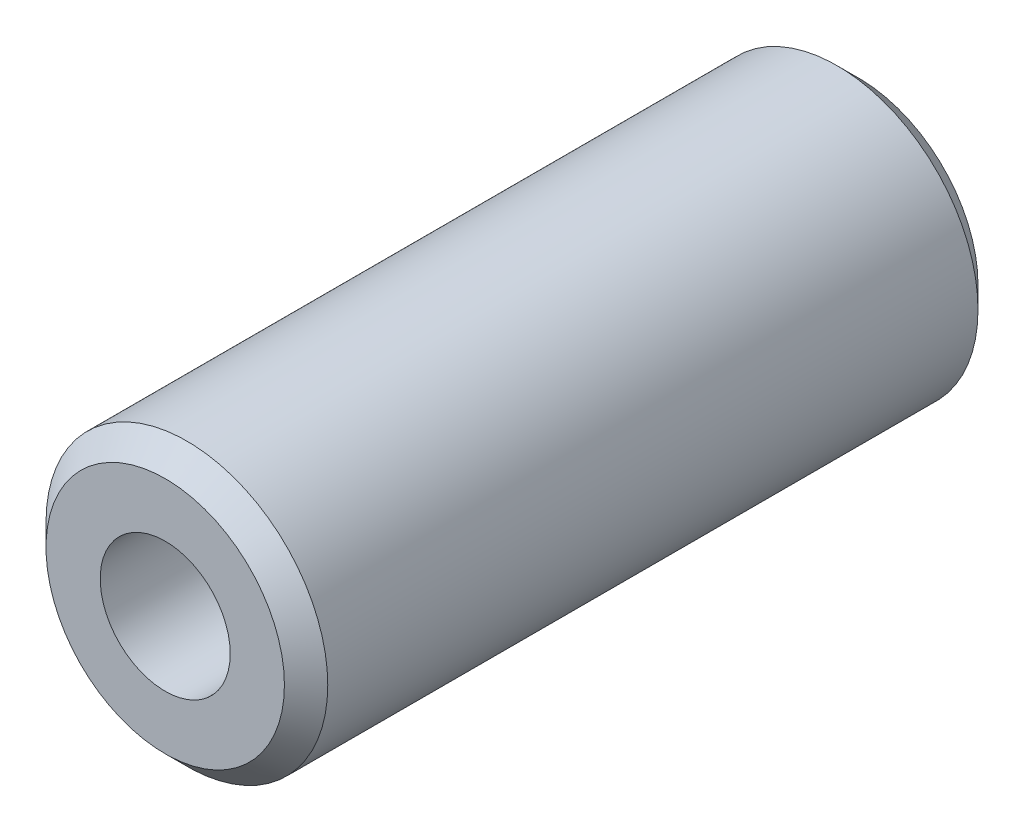
ISO-10303-21;
HEADER;
FILE_DESCRIPTION(('STEP AP214'),'2;1');
FILE_NAME('part.step','',(''),(''),'','','');
FILE_SCHEMA(('AUTOMOTIVE_DESIGN { 1 0 10303 214 1 1 1 1 }'));
ENDSEC;
DATA;
#1=APPLICATION_CONTEXT('core data for automotive mechanical design processes');
#2=APPLICATION_PROTOCOL_DEFINITION('international standard','automotive_design',2000,#1);
#3=PRODUCT_CONTEXT('',#1,'mechanical');
#4=PRODUCT('Part','Part','',(#3));
#5=PRODUCT_RELATED_PRODUCT_CATEGORY('part','',(#4));
#6=PRODUCT_DEFINITION_FORMATION('','',#4);
#7=PRODUCT_DEFINITION_CONTEXT('part definition',#1,'design');
#8=PRODUCT_DEFINITION('design','',#6,#7);
#9=PRODUCT_DEFINITION_SHAPE('','',#8);
#10=(LENGTH_UNIT() NAMED_UNIT(*) SI_UNIT(.MILLI.,.METRE.));
#11=(NAMED_UNIT(*) PLANE_ANGLE_UNIT() SI_UNIT($,.RADIAN.));
#12=(NAMED_UNIT(*) SI_UNIT($,.STERADIAN.) SOLID_ANGLE_UNIT());
#13=UNCERTAINTY_MEASURE_WITH_UNIT(LENGTH_MEASURE(1.E-05),#10,'distance_accuracy_value','');
#14=(GEOMETRIC_REPRESENTATION_CONTEXT(3) GLOBAL_UNCERTAINTY_ASSIGNED_CONTEXT((#13)) GLOBAL_UNIT_ASSIGNED_CONTEXT((#10,
#11,#12)) REPRESENTATION_CONTEXT('',''));
#15=CARTESIAN_POINT('',(0.,0.,0.));
#16=DIRECTION('',(0.,0.,1.));
#17=DIRECTION('',(1.,0.,0.));
#18=AXIS2_PLACEMENT_3D('',#15,#16,#17);
#19=CARTESIAN_POINT('',(0.,0.,32.));
#20=DIRECTION('',(0.,0.,1.));
#21=DIRECTION('',(1.,0.,0.));
#22=AXIS2_PLACEMENT_3D('',#19,#20,#21);
#23=PLANE('',#22);
#24=CARTESIAN_POINT('',(0.,0.,32.));
#25=DIRECTION('',(0.,0.,1.));
#26=DIRECTION('',(1.,0.,0.));
#27=AXIS2_PLACEMENT_3D('',#24,#25,#26);
#28=CIRCLE('',#27,5.5);
#29=CARTESIAN_POINT('',(5.5,0.,32.));
#30=VERTEX_POINT('',#29);
#31=EDGE_CURVE('E10',#30,#30,#28,.T.);
#32=ORIENTED_EDGE('',*,*,#31,.T.);
#33=EDGE_LOOP('',(#32));
#34=FACE_BOUND('',#33,.T.);
#35=CARTESIAN_POINT('',(0.,0.,32.));
#36=DIRECTION('',(0.,0.,1.));
#37=DIRECTION('',(1.,0.,0.));
#38=AXIS2_PLACEMENT_3D('',#35,#36,#37);
#39=CIRCLE('',#38,3.);
#40=CARTESIAN_POINT('',(3.,0.,32.));
#41=VERTEX_POINT('',#40);
#42=EDGE_CURVE('E65',#41,#41,#39,.T.);
#43=ORIENTED_EDGE('',*,*,#42,.F.);
#44=EDGE_LOOP('',(#43));
#45=FACE_BOUND('',#44,.T.);
#46=ADVANCED_FACE('F41',(#34,#45),#23,.T.);
#47=CARTESIAN_POINT('',(0.,0.,0.));
#48=DIRECTION('',(0.,0.,1.));
#49=DIRECTION('',(1.,0.,0.));
#50=AXIS2_PLACEMENT_3D('',#47,#48,#49);
#51=PLANE('',#50);
#52=CARTESIAN_POINT('',(0.,0.,0.));
#53=DIRECTION('',(0.,0.,1.));
#54=DIRECTION('',(1.,0.,0.));
#55=AXIS2_PLACEMENT_3D('',#52,#53,#54);
#56=CIRCLE('',#55,5.5);
#57=CARTESIAN_POINT('',(5.5,0.,0.));
#58=VERTEX_POINT('',#57);
#59=EDGE_CURVE('E47',#58,#58,#56,.F.);
#60=ORIENTED_EDGE('',*,*,#59,.T.);
#61=EDGE_LOOP('',(#60));
#62=FACE_BOUND('',#61,.T.);
#63=CARTESIAN_POINT('',(0.,0.,0.));
#64=DIRECTION('',(0.,0.,1.));
#65=DIRECTION('',(1.,0.,0.));
#66=AXIS2_PLACEMENT_3D('',#63,#64,#65);
#67=CIRCLE('',#66,3.);
#68=CARTESIAN_POINT('',(3.,0.,0.));
#69=VERTEX_POINT('',#68);
#70=EDGE_CURVE('E64',#69,#69,#67,.T.);
#71=ORIENTED_EDGE('',*,*,#70,.T.);
#72=EDGE_LOOP('',(#71));
#73=FACE_BOUND('',#72,.T.);
#74=ADVANCED_FACE('F71',(#62,#73),#51,.F.);
#75=CARTESIAN_POINT('',(0.,0.,32.));
#76=DIRECTION('',(0.,0.,-1.));
#77=DIRECTION('',(-1.,0.,0.));
#78=AXIS2_PLACEMENT_3D('',#75,#76,#77);
#79=CYLINDRICAL_SURFACE('',#78,6.5);
#80=CARTESIAN_POINT('',(0.,0.,1.));
#81=DIRECTION('',(0.,0.,1.));
#82=DIRECTION('',(1.,0.,0.));
#83=AXIS2_PLACEMENT_3D('',#80,#81,#82);
#84=CIRCLE('',#83,6.5);
#85=CARTESIAN_POINT('',(6.5,0.,1.));
#86=VERTEX_POINT('',#85);
#87=EDGE_CURVE('E52',#86,#86,#84,.T.);
#88=ORIENTED_EDGE('',*,*,#87,.T.);
#89=EDGE_LOOP('',(#88));
#90=FACE_BOUND('',#89,.T.);
#91=CARTESIAN_POINT('',(0.,0.,31.));
#92=DIRECTION('',(0.,0.,1.));
#93=DIRECTION('',(1.,0.,0.));
#94=AXIS2_PLACEMENT_3D('',#91,#92,#93);
#95=CIRCLE('',#94,6.5);
#96=CARTESIAN_POINT('',(6.5,0.,31.));
#97=VERTEX_POINT('',#96);
#98=EDGE_CURVE('E60',#97,#97,#95,.F.);
#99=ORIENTED_EDGE('',*,*,#98,.T.);
#100=EDGE_LOOP('',(#99));
#101=FACE_BOUND('',#100,.T.);
#102=ADVANCED_FACE('F76',(#90,#101),#79,.T.);
#103=CARTESIAN_POINT('',(0.,0.,32.));
#104=DIRECTION('',(0.,0.,-1.));
#105=DIRECTION('',(-1.,0.,0.));
#106=AXIS2_PLACEMENT_3D('',#103,#104,#105);
#107=CYLINDRICAL_SURFACE('',#106,3.);
#108=ORIENTED_EDGE('',*,*,#42,.T.);
#109=EDGE_LOOP('',(#108));
#110=FACE_BOUND('',#109,.T.);
#111=ORIENTED_EDGE('',*,*,#70,.F.);
#112=EDGE_LOOP('',(#111));
#113=FACE_BOUND('',#112,.T.);
#114=ADVANCED_FACE('F68',(#110,#113),#107,.F.);
#115=CARTESIAN_POINT('',(0.,0.,1.));
#116=DIRECTION('',(0.,0.,1.));
#117=DIRECTION('',(1.,0.,0.));
#118=AXIS2_PLACEMENT_3D('',#115,#116,#117);
#119=CONICAL_SURFACE('',#118,6.5,0.785398163397449);
#120=ORIENTED_EDGE('',*,*,#59,.F.);
#121=EDGE_LOOP('',(#120));
#122=FACE_BOUND('',#121,.T.);
#123=ORIENTED_EDGE('',*,*,#87,.F.);
#124=EDGE_LOOP('',(#123));
#125=FACE_BOUND('',#124,.T.);
#126=ADVANCED_FACE('F88',(#122,#125),#119,.T.);
#127=CARTESIAN_POINT('',(0.,0.,32.));
#128=DIRECTION('',(0.,0.,-1.));
#129=DIRECTION('',(-1.,0.,0.));
#130=AXIS2_PLACEMENT_3D('',#127,#128,#129);
#131=CONICAL_SURFACE('',#130,5.5,0.785398163397446);
#132=ORIENTED_EDGE('',*,*,#98,.F.);
#133=EDGE_LOOP('',(#132));
#134=FACE_BOUND('',#133,.T.);
#135=ORIENTED_EDGE('',*,*,#31,.F.);
#136=EDGE_LOOP('',(#135));
#137=FACE_BOUND('',#136,.T.);
#138=ADVANCED_FACE('F42',(#134,#137),#131,.T.);
#139=CLOSED_SHELL('',(#46,#74,#102,#114,#126,#138));
#140=MANIFOLD_SOLID_BREP('B2',#139);
#141=ADVANCED_BREP_SHAPE_REPRESENTATION('',(#18,#140),#14);
#142=SHAPE_DEFINITION_REPRESENTATION(#9,#141);
ENDSEC;
END-ISO-10303-21;
